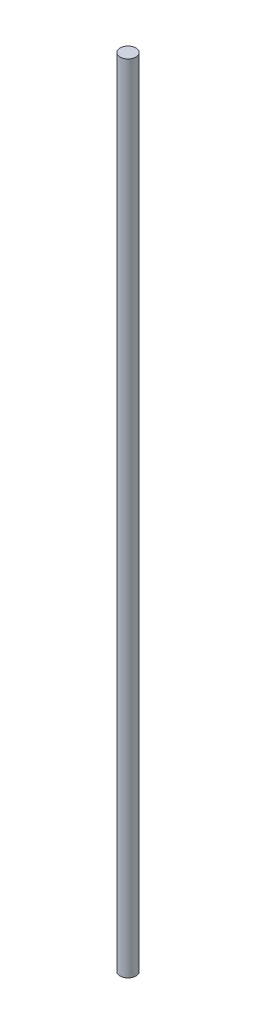
ISO-10303-21;
HEADER;
FILE_DESCRIPTION(('STEP AP214'),'2;1');
FILE_NAME('part.step','',(''),(''),'','','');
FILE_SCHEMA(('AUTOMOTIVE_DESIGN { 1 0 10303 214 1 1 1 1 }'));
ENDSEC;
DATA;
#1=APPLICATION_CONTEXT('core data for automotive mechanical design processes');
#2=APPLICATION_PROTOCOL_DEFINITION('international standard','automotive_design',2000,#1);
#3=PRODUCT_CONTEXT('',#1,'mechanical');
#4=PRODUCT('Part','Part','',(#3));
#5=PRODUCT_RELATED_PRODUCT_CATEGORY('part','',(#4));
#6=PRODUCT_DEFINITION_FORMATION('','',#4);
#7=PRODUCT_DEFINITION_CONTEXT('part definition',#1,'design');
#8=PRODUCT_DEFINITION('design','',#6,#7);
#9=PRODUCT_DEFINITION_SHAPE('','',#8);
#10=(LENGTH_UNIT() NAMED_UNIT(*) SI_UNIT(.MILLI.,.METRE.));
#11=(NAMED_UNIT(*) PLANE_ANGLE_UNIT() SI_UNIT($,.RADIAN.));
#12=(NAMED_UNIT(*) SI_UNIT($,.STERADIAN.) SOLID_ANGLE_UNIT());
#13=UNCERTAINTY_MEASURE_WITH_UNIT(LENGTH_MEASURE(1.E-05),#10,'distance_accuracy_value','');
#14=(GEOMETRIC_REPRESENTATION_CONTEXT(3) GLOBAL_UNCERTAINTY_ASSIGNED_CONTEXT((#13)) GLOBAL_UNIT_ASSIGNED_CONTEXT((#10,
#11,#12)) REPRESENTATION_CONTEXT('',''));
#15=CARTESIAN_POINT('',(0.,0.,0.));
#16=DIRECTION('',(0.,0.,1.));
#17=DIRECTION('',(1.,0.,0.));
#18=AXIS2_PLACEMENT_3D('',#15,#16,#17);
#19=CARTESIAN_POINT('',(0.,200.,0.));
#20=DIRECTION('',(0.,-1.,0.));
#21=DIRECTION('',(0.,0.,-1.));
#22=AXIS2_PLACEMENT_3D('',#19,#20,#21);
#23=CYLINDRICAL_SURFACE('',#22,4.);
#24=CARTESIAN_POINT('',(0.,200.,0.));
#25=DIRECTION('',(0.,1.,0.));
#26=DIRECTION('',(0.,0.,1.));
#27=AXIS2_PLACEMENT_3D('',#24,#25,#26);
#28=CIRCLE('',#27,4.);
#29=CARTESIAN_POINT('',(0.,200.,4.));
#30=VERTEX_POINT('',#29);
#31=EDGE_CURVE('E10',#30,#30,#28,.T.);
#32=ORIENTED_EDGE('',*,*,#31,.F.);
#33=EDGE_LOOP('',(#32));
#34=FACE_BOUND('',#33,.T.);
#35=CARTESIAN_POINT('',(0.,-200.,0.));
#36=DIRECTION('',(0.,1.,0.));
#37=DIRECTION('',(0.,0.,1.));
#38=AXIS2_PLACEMENT_3D('',#35,#36,#37);
#39=CIRCLE('',#38,4.);
#40=CARTESIAN_POINT('',(0.,-200.,4.));
#41=VERTEX_POINT('',#40);
#42=EDGE_CURVE('E38',#41,#41,#39,.T.);
#43=ORIENTED_EDGE('',*,*,#42,.T.);
#44=EDGE_LOOP('',(#43));
#45=FACE_BOUND('',#44,.T.);
#46=ADVANCED_FACE('F35',(#34,#45),#23,.T.);
#47=CARTESIAN_POINT('',(0.,200.,0.));
#48=DIRECTION('',(0.,1.,0.));
#49=DIRECTION('',(0.,0.,1.));
#50=AXIS2_PLACEMENT_3D('',#47,#48,#49);
#51=PLANE('',#50);
#52=ORIENTED_EDGE('',*,*,#31,.T.);
#53=EDGE_LOOP('',(#52));
#54=FACE_BOUND('',#53,.T.);
#55=ADVANCED_FACE('F50',(#54),#51,.T.);
#56=CARTESIAN_POINT('',(0.,-200.,0.));
#57=DIRECTION('',(0.,1.,0.));
#58=DIRECTION('',(0.,0.,1.));
#59=AXIS2_PLACEMENT_3D('',#56,#57,#58);
#60=PLANE('',#59);
#61=ORIENTED_EDGE('',*,*,#42,.F.);
#62=EDGE_LOOP('',(#61));
#63=FACE_BOUND('',#62,.T.);
#64=ADVANCED_FACE('F48',(#63),#60,.F.);
#65=CLOSED_SHELL('',(#46,#55,#64));
#66=MANIFOLD_SOLID_BREP('B2',#65);
#67=ADVANCED_BREP_SHAPE_REPRESENTATION('',(#18,#66),#14);
#68=SHAPE_DEFINITION_REPRESENTATION(#9,#67);
ENDSEC;
END-ISO-10303-21;
